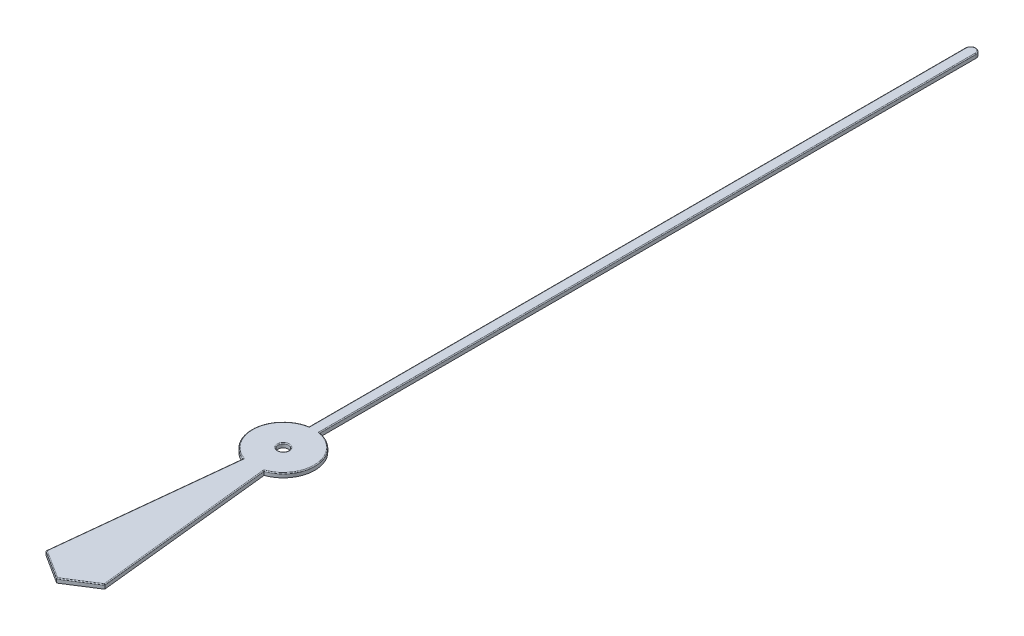
ISO-10303-21;
HEADER;
FILE_DESCRIPTION(('STEP AP214'),'2;1');
FILE_NAME('part.step','',(''),(''),'','','');
FILE_SCHEMA(('AUTOMOTIVE_DESIGN { 1 0 10303 214 1 1 1 1 }'));
ENDSEC;
DATA;
#1=APPLICATION_CONTEXT('core data for automotive mechanical design processes');
#2=APPLICATION_PROTOCOL_DEFINITION('international standard','automotive_design',2000,#1);
#3=PRODUCT_CONTEXT('',#1,'mechanical');
#4=PRODUCT('Part','Part','',(#3));
#5=PRODUCT_RELATED_PRODUCT_CATEGORY('part','',(#4));
#6=PRODUCT_DEFINITION_FORMATION('','',#4);
#7=PRODUCT_DEFINITION_CONTEXT('part definition',#1,'design');
#8=PRODUCT_DEFINITION('design','',#6,#7);
#9=PRODUCT_DEFINITION_SHAPE('','',#8);
#10=(LENGTH_UNIT() NAMED_UNIT(*) SI_UNIT(.MILLI.,.METRE.));
#11=(NAMED_UNIT(*) PLANE_ANGLE_UNIT() SI_UNIT($,.RADIAN.));
#12=(NAMED_UNIT(*) SI_UNIT($,.STERADIAN.) SOLID_ANGLE_UNIT());
#13=UNCERTAINTY_MEASURE_WITH_UNIT(LENGTH_MEASURE(1.E-05),#10,'distance_accuracy_value','');
#14=(GEOMETRIC_REPRESENTATION_CONTEXT(3) GLOBAL_UNCERTAINTY_ASSIGNED_CONTEXT((#13)) GLOBAL_UNIT_ASSIGNED_CONTEXT((#10,
#11,#12)) REPRESENTATION_CONTEXT('',''));
#15=CARTESIAN_POINT('',(0.,0.,0.));
#16=DIRECTION('',(0.,0.,1.));
#17=DIRECTION('',(1.,0.,0.));
#18=AXIS2_PLACEMENT_3D('',#15,#16,#17);
#19=CARTESIAN_POINT('',(0.,0.1,0.));
#20=DIRECTION('',(0.,1.,0.));
#21=DIRECTION('',(0.,0.,1.));
#22=AXIS2_PLACEMENT_3D('',#19,#20,#21);
#23=PLANE('',#22);
#24=CARTESIAN_POINT('',(0.,0.1,0.));
#25=DIRECTION('',(0.,1.,0.));
#26=DIRECTION('',(0.,0.,1.));
#27=AXIS2_PLACEMENT_3D('',#24,#25,#26);
#28=CIRCLE('',#27,0.145);
#29=CARTESIAN_POINT('',(0.,0.1,0.145));
#30=VERTEX_POINT('',#29);
#31=EDGE_CURVE('E233',#30,#30,#28,.F.);
#32=ORIENTED_EDGE('',*,*,#31,.T.);
#33=EDGE_LOOP('',(#32));
#34=FACE_BOUND('',#33,.T.);
#35=CARTESIAN_POINT('',(0.,0.1,0.));
#36=DIRECTION('',(0.,1.,0.));
#37=DIRECTION('',(0.,0.,1.));
#38=AXIS2_PLACEMENT_3D('',#35,#36,#37);
#39=CIRCLE('',#38,0.73);
#40=CARTESIAN_POINT('',(0.228429309852145,0.1,0.693339779906268));
#41=VERTEX_POINT('',#40);
#42=CARTESIAN_POINT('',(0.105,0.1,-0.722409163839994));
#43=VERTEX_POINT('',#42);
#44=EDGE_CURVE('E228',#41,#43,#39,.T.);
#45=ORIENTED_EDGE('',*,*,#44,.T.);
#46=DIRECTION('',(0.,0.,-1.));
#47=VECTOR('',#46,1.);
#48=CARTESIAN_POINT('',(0.105,0.1,-16.375));
#49=LINE('',#48,#47);
#50=CARTESIAN_POINT('',(0.105,0.1,-16.375));
#51=VERTEX_POINT('',#50);
#52=EDGE_CURVE('E230',#43,#51,#49,.T.);
#53=ORIENTED_EDGE('',*,*,#52,.T.);
#54=CARTESIAN_POINT('',(0.,0.1,-16.375));
#55=DIRECTION('',(0.,1.,0.));
#56=DIRECTION('',(0.,0.,1.));
#57=AXIS2_PLACEMENT_3D('',#54,#55,#56);
#58=CIRCLE('',#57,0.105);
#59=CARTESIAN_POINT('',(0.,0.1,-16.48));
#60=VERTEX_POINT('',#59);
#61=EDGE_CURVE('E212',#51,#60,#58,.T.);
#62=ORIENTED_EDGE('',*,*,#61,.T.);
#63=CARTESIAN_POINT('',(0.,0.1,-16.375));
#64=DIRECTION('',(0.,1.,0.));
#65=DIRECTION('',(0.,0.,1.));
#66=AXIS2_PLACEMENT_3D('',#63,#64,#65);
#67=CIRCLE('',#66,0.105);
#68=CARTESIAN_POINT('',(-0.105,0.1,-16.375));
#69=VERTEX_POINT('',#68);
#70=EDGE_CURVE('E214',#60,#69,#67,.T.);
#71=ORIENTED_EDGE('',*,*,#70,.T.);
#72=DIRECTION('',(0.,0.,1.));
#73=VECTOR('',#72,1.);
#74=CARTESIAN_POINT('',(-0.105,0.1,-0.739509972887452));
#75=LINE('',#74,#73);
#76=CARTESIAN_POINT('',(-0.105,0.1,-0.722409163839994));
#77=VERTEX_POINT('',#76);
#78=EDGE_CURVE('E216',#69,#77,#75,.T.);
#79=ORIENTED_EDGE('',*,*,#78,.T.);
#80=CARTESIAN_POINT('',(0.,0.1,0.));
#81=DIRECTION('',(0.,1.,0.));
#82=DIRECTION('',(0.,0.,1.));
#83=AXIS2_PLACEMENT_3D('',#80,#81,#82);
#84=CIRCLE('',#83,0.73);
#85=CARTESIAN_POINT('',(-0.228429309852145,0.1,0.693339779906268));
#86=VERTEX_POINT('',#85);
#87=EDGE_CURVE('E218',#77,#86,#84,.T.);
#88=ORIENTED_EDGE('',*,*,#87,.T.);
#89=DIRECTION('',(-0.105368695050218,0.,0.994433224557292));
#90=VECTOR('',#89,1.);
#91=CARTESIAN_POINT('',(-0.680111335508854,0.1,4.95615819133576));
#92=LINE('',#91,#90);
#93=CARTESIAN_POINT('',(-0.678806021477439,0.1,4.94383908991099));
#94=VERTEX_POINT('',#93);
#95=EDGE_CURVE('E220',#86,#94,#92,.T.);
#96=ORIENTED_EDGE('',*,*,#95,.T.);
#97=DIRECTION('',(0.843391445812887,0.,0.537299608346822));
#98=VECTOR('',#97,1.);
#99=CARTESIAN_POINT('',(0.0107459921669384,0.1,5.38313217108374));
#100=LINE('',#99,#98);
#101=CARTESIAN_POINT('',(0.,0.1,5.37628621905132));
#102=VERTEX_POINT('',#101);
#103=EDGE_CURVE('E222',#94,#102,#100,.T.);
#104=ORIENTED_EDGE('',*,*,#103,.T.);
#105=DIRECTION('',(0.843391445812887,0.,-0.537299608346822));
#106=VECTOR('',#105,1.);
#107=CARTESIAN_POINT('',(0.689254007833063,0.1,4.9371829885185));
#108=LINE('',#107,#106);
#109=CARTESIAN_POINT('',(0.67880602147744,0.1,4.94383908991099));
#110=VERTEX_POINT('',#109);
#111=EDGE_CURVE('E224',#102,#110,#108,.T.);
#112=ORIENTED_EDGE('',*,*,#111,.T.);
#113=DIRECTION('',(-0.105368695050219,0.,-0.994433224557292));
#114=VECTOR('',#113,1.);
#115=CARTESIAN_POINT('',(0.230111335508854,0.1,0.709214155087552));
#116=LINE('',#115,#114);
#117=EDGE_CURVE('E226',#110,#41,#116,.T.);
#118=ORIENTED_EDGE('',*,*,#117,.T.);
#119=EDGE_LOOP('',(#45,#53,#62,#71,#79,#88,#96,#104,#112,#118));
#120=FACE_BOUND('',#119,.T.);
#121=ADVANCED_FACE('F31',(#34,#120),#23,.T.);
#122=CARTESIAN_POINT('',(0.,0.,0.));
#123=DIRECTION('',(0.,1.,0.));
#124=DIRECTION('',(0.,0.,1.));
#125=AXIS2_PLACEMENT_3D('',#122,#123,#124);
#126=PLANE('',#125);
#127=DIRECTION('',(0.,0.,1.));
#128=VECTOR('',#127,1.);
#129=CARTESIAN_POINT('',(-0.125,0.,-0.739509972887452));
#130=LINE('',#129,#128);
#131=CARTESIAN_POINT('',(-0.125,0.,-16.375));
#132=VERTEX_POINT('',#131);
#133=CARTESIAN_POINT('',(-0.125,0.,-0.739509972887452));
#134=VERTEX_POINT('',#133);
#135=EDGE_CURVE('E178',#132,#134,#130,.T.);
#136=ORIENTED_EDGE('',*,*,#135,.F.);
#137=CARTESIAN_POINT('',(0.,0.,-16.375));
#138=DIRECTION('',(0.,1.,0.));
#139=DIRECTION('',(0.,0.,1.));
#140=AXIS2_PLACEMENT_3D('',#137,#138,#139);
#141=CIRCLE('',#140,0.125);
#142=CARTESIAN_POINT('',(0.,0.,-16.5));
#143=VERTEX_POINT('',#142);
#144=EDGE_CURVE('E202',#132,#143,#141,.F.);
#145=ORIENTED_EDGE('',*,*,#144,.T.);
#146=CARTESIAN_POINT('',(0.,0.,-16.375));
#147=DIRECTION('',(0.,1.,0.));
#148=DIRECTION('',(0.,0.,1.));
#149=AXIS2_PLACEMENT_3D('',#146,#147,#148);
#150=CIRCLE('',#149,0.125);
#151=CARTESIAN_POINT('',(0.125,0.,-16.375));
#152=VERTEX_POINT('',#151);
#153=EDGE_CURVE('E200',#143,#152,#150,.F.);
#154=ORIENTED_EDGE('',*,*,#153,.T.);
#155=DIRECTION('',(0.,0.,-1.));
#156=VECTOR('',#155,1.);
#157=CARTESIAN_POINT('',(0.125,0.,-0.739509972887452));
#158=LINE('',#157,#156);
#159=CARTESIAN_POINT('',(0.125,0.,-0.739509972887452));
#160=VERTEX_POINT('',#159);
#161=EDGE_CURVE('E175',#160,#152,#158,.T.);
#162=ORIENTED_EDGE('',*,*,#161,.F.);
#163=CARTESIAN_POINT('',(0.,0.,0.));
#164=DIRECTION('',(0.,1.,0.));
#165=DIRECTION('',(0.,0.,1.));
#166=AXIS2_PLACEMENT_3D('',#163,#164,#165);
#167=CIRCLE('',#166,0.75);
#168=CARTESIAN_POINT('',(0.25,0.,0.707106781186547));
#169=VERTEX_POINT('',#168);
#170=EDGE_CURVE('E162',#169,#160,#167,.T.);
#171=ORIENTED_EDGE('',*,*,#170,.F.);
#172=DIRECTION('',(-0.105368695050219,0.,-0.994433224557292));
#173=VECTOR('',#172,1.);
#174=CARTESIAN_POINT('',(0.25,0.,0.707106781186547));
#175=LINE('',#174,#173);
#176=CARTESIAN_POINT('',(0.700000000000001,0.,4.95405081743476));
#177=VERTEX_POINT('',#176);
#178=EDGE_CURVE('E143',#177,#169,#175,.T.);
#179=ORIENTED_EDGE('',*,*,#178,.F.);
#180=DIRECTION('',(0.843391445812887,0.,-0.537299608346822));
#181=VECTOR('',#180,1.);
#182=CARTESIAN_POINT('',(0.700000000000001,0.,4.95405081743476));
#183=LINE('',#182,#181);
#184=CARTESIAN_POINT('',(0.,0.,5.4));
#185=VERTEX_POINT('',#184);
#186=EDGE_CURVE('E159',#185,#177,#183,.T.);
#187=ORIENTED_EDGE('',*,*,#186,.F.);
#188=DIRECTION('',(0.843391445812887,0.,0.537299608346822));
#189=VECTOR('',#188,1.);
#190=CARTESIAN_POINT('',(-0.699999999999999,0.,4.95405081743476));
#191=LINE('',#190,#189);
#192=CARTESIAN_POINT('',(-0.699999999999999,0.,4.95405081743476));
#193=VERTEX_POINT('',#192);
#194=EDGE_CURVE('E187',#193,#185,#191,.T.);
#195=ORIENTED_EDGE('',*,*,#194,.F.);
#196=DIRECTION('',(-0.105368695050218,0.,0.994433224557292));
#197=VECTOR('',#196,1.);
#198=CARTESIAN_POINT('',(-0.25,0.,0.707106781186547));
#199=LINE('',#198,#197);
#200=CARTESIAN_POINT('',(-0.25,0.,0.707106781186547));
#201=VERTEX_POINT('',#200);
#202=EDGE_CURVE('E184',#201,#193,#199,.T.);
#203=ORIENTED_EDGE('',*,*,#202,.F.);
#204=CARTESIAN_POINT('',(0.,0.,0.));
#205=DIRECTION('',(0.,1.,0.));
#206=DIRECTION('',(0.,0.,1.));
#207=AXIS2_PLACEMENT_3D('',#204,#205,#206);
#208=CIRCLE('',#207,0.75);
#209=EDGE_CURVE('E181',#134,#201,#208,.T.);
#210=ORIENTED_EDGE('',*,*,#209,.F.);
#211=EDGE_LOOP('',(#136,#145,#154,#162,#171,#179,#187,#195,#203,#210));
#212=FACE_BOUND('',#211,.T.);
#213=CARTESIAN_POINT('',(0.,0.,0.));
#214=DIRECTION('',(0.,1.,0.));
#215=DIRECTION('',(0.,0.,1.));
#216=AXIS2_PLACEMENT_3D('',#213,#214,#215);
#217=CIRCLE('',#216,0.125);
#218=CARTESIAN_POINT('',(0.,0.,0.125));
#219=VERTEX_POINT('',#218);
#220=EDGE_CURVE('E168',#219,#219,#217,.T.);
#221=ORIENTED_EDGE('',*,*,#220,.T.);
#222=EDGE_LOOP('',(#221));
#223=FACE_BOUND('',#222,.T.);
#224=ADVANCED_FACE('F156',(#212,#223),#126,.F.);
#225=CARTESIAN_POINT('',(0.700000000000001,0.1,4.95405081743476));
#226=DIRECTION('',(-0.537299608346822,0.,-0.843391445812887));
#227=DIRECTION('',(-0.843391445812887,0.,0.537299608346822));
#228=AXIS2_PLACEMENT_3D('',#225,#226,#227);
#229=PLANE('',#228);
#230=DIRECTION('',(0.,-1.,0.));
#231=VECTOR('',#230,1.);
#232=CARTESIAN_POINT('',(0.700000000000001,0.1,4.95405081743476));
#233=LINE('',#232,#231);
#234=CARTESIAN_POINT('',(0.700000000000001,0.08,4.95405081743476));
#235=VERTEX_POINT('',#234);
#236=EDGE_CURVE('E139',#235,#177,#233,.T.);
#237=ORIENTED_EDGE('',*,*,#236,.F.);
#238=DIRECTION('',(0.843391445812887,0.,-0.537299608346822));
#239=VECTOR('',#238,1.);
#240=CARTESIAN_POINT('',(0.,0.08,5.4));
#241=LINE('',#240,#239);
#242=CARTESIAN_POINT('',(0.,0.08,5.4));
#243=VERTEX_POINT('',#242);
#244=EDGE_CURVE('E242',#235,#243,#241,.F.);
#245=ORIENTED_EDGE('',*,*,#244,.T.);
#246=DIRECTION('',(0.,-1.,0.));
#247=VECTOR('',#246,1.);
#248=CARTESIAN_POINT('',(0.,0.1,5.4));
#249=LINE('',#248,#247);
#250=EDGE_CURVE('E166',#243,#185,#249,.T.);
#251=ORIENTED_EDGE('',*,*,#250,.T.);
#252=ORIENTED_EDGE('',*,*,#186,.T.);
#253=EDGE_LOOP('',(#237,#245,#251,#252));
#254=FACE_BOUND('',#253,.T.);
#255=ADVANCED_FACE('F164',(#254),#229,.F.);
#256=CARTESIAN_POINT('',(0.25,0.1,0.707106781186547));
#257=DIRECTION('',(-0.994433224557292,0.,0.105368695050219));
#258=DIRECTION('',(0.105368695050219,0.,0.994433224557292));
#259=AXIS2_PLACEMENT_3D('',#256,#257,#258);
#260=PLANE('',#259);
#261=DIRECTION('',(0.,-1.,0.));
#262=VECTOR('',#261,1.);
#263=CARTESIAN_POINT('',(0.25,0.1,0.707106781186547));
#264=LINE('',#263,#262);
#265=CARTESIAN_POINT('',(0.25,0.08,0.707106781186547));
#266=VERTEX_POINT('',#265);
#267=EDGE_CURVE('E151',#266,#169,#264,.T.);
#268=ORIENTED_EDGE('',*,*,#267,.F.);
#269=DIRECTION('',(-0.105368695050219,0.,-0.994433224557292));
#270=VECTOR('',#269,1.);
#271=CARTESIAN_POINT('',(0.700000000000001,0.08,4.95405081743476));
#272=LINE('',#271,#270);
#273=EDGE_CURVE('E146',#266,#235,#272,.F.);
#274=ORIENTED_EDGE('',*,*,#273,.T.);
#275=ORIENTED_EDGE('',*,*,#236,.T.);
#276=ORIENTED_EDGE('',*,*,#178,.T.);
#277=EDGE_LOOP('',(#268,#274,#275,#276));
#278=FACE_BOUND('',#277,.T.);
#279=ADVANCED_FACE('F142',(#278),#260,.F.);
#280=CARTESIAN_POINT('',(0.,0.1,0.));
#281=DIRECTION('',(0.,-1.,0.));
#282=DIRECTION('',(0.,0.,-1.));
#283=AXIS2_PLACEMENT_3D('',#280,#281,#282);
#284=CYLINDRICAL_SURFACE('',#283,0.75);
#285=DIRECTION('',(0.,-1.,0.));
#286=VECTOR('',#285,1.);
#287=CARTESIAN_POINT('',(0.125,0.1,-0.739509972887452));
#288=LINE('',#287,#286);
#289=CARTESIAN_POINT('',(0.125,0.08,-0.739509972887452));
#290=VERTEX_POINT('',#289);
#291=EDGE_CURVE('E196',#290,#160,#288,.T.);
#292=ORIENTED_EDGE('',*,*,#291,.F.);
#293=CARTESIAN_POINT('',(0.,0.08,0.));
#294=DIRECTION('',(0.,1.,0.));
#295=DIRECTION('',(0.,0.,1.));
#296=AXIS2_PLACEMENT_3D('',#293,#294,#295);
#297=CIRCLE('',#296,0.75);
#298=EDGE_CURVE('E239',#290,#266,#297,.F.);
#299=ORIENTED_EDGE('',*,*,#298,.T.);
#300=ORIENTED_EDGE('',*,*,#267,.T.);
#301=ORIENTED_EDGE('',*,*,#170,.T.);
#302=EDGE_LOOP('',(#292,#299,#300,#301));
#303=FACE_BOUND('',#302,.T.);
#304=ADVANCED_FACE('F354',(#303),#284,.T.);
#305=CARTESIAN_POINT('',(0.125,0.1,-0.739509972887452));
#306=DIRECTION('',(-1.,0.,0.));
#307=DIRECTION('',(0.,0.,1.));
#308=AXIS2_PLACEMENT_3D('',#305,#306,#307);
#309=PLANE('',#308);
#310=DIRECTION('',(0.,-1.,0.));
#311=VECTOR('',#310,1.);
#312=CARTESIAN_POINT('',(0.125,0.1,-16.375));
#313=LINE('',#312,#311);
#314=CARTESIAN_POINT('',(0.125,0.08,-16.375));
#315=VERTEX_POINT('',#314);
#316=EDGE_CURVE('E205',#152,#315,#313,.F.);
#317=ORIENTED_EDGE('',*,*,#316,.T.);
#318=DIRECTION('',(0.,0.,-1.));
#319=VECTOR('',#318,1.);
#320=CARTESIAN_POINT('',(0.125,0.08,-0.739509972887452));
#321=LINE('',#320,#319);
#322=EDGE_CURVE('E236',#315,#290,#321,.F.);
#323=ORIENTED_EDGE('',*,*,#322,.T.);
#324=ORIENTED_EDGE('',*,*,#291,.T.);
#325=ORIENTED_EDGE('',*,*,#161,.T.);
#326=EDGE_LOOP('',(#317,#323,#324,#325));
#327=FACE_BOUND('',#326,.T.);
#328=ADVANCED_FACE('F351',(#327),#309,.F.);
#329=CARTESIAN_POINT('',(-0.125,0.1,-0.739509972887452));
#330=DIRECTION('',(1.,0.,0.));
#331=DIRECTION('',(0.,0.,-1.));
#332=AXIS2_PLACEMENT_3D('',#329,#330,#331);
#333=PLANE('',#332);
#334=DIRECTION('',(0.,-1.,0.));
#335=VECTOR('',#334,1.);
#336=CARTESIAN_POINT('',(-0.125,0.1,-0.739509972887452));
#337=LINE('',#336,#335);
#338=CARTESIAN_POINT('',(-0.125,0.08,-0.739509972887452));
#339=VERTEX_POINT('',#338);
#340=EDGE_CURVE('E194',#339,#134,#337,.T.);
#341=ORIENTED_EDGE('',*,*,#340,.F.);
#342=DIRECTION('',(0.,0.,1.));
#343=VECTOR('',#342,1.);
#344=CARTESIAN_POINT('',(-0.125,0.08,-16.375));
#345=LINE('',#344,#343);
#346=CARTESIAN_POINT('',(-0.125,0.08,-16.375));
#347=VERTEX_POINT('',#346);
#348=EDGE_CURVE('E55',#339,#347,#345,.F.);
#349=ORIENTED_EDGE('',*,*,#348,.T.);
#350=DIRECTION('',(0.,-1.,0.));
#351=VECTOR('',#350,1.);
#352=CARTESIAN_POINT('',(-0.125,0.1,-16.375));
#353=LINE('',#352,#351);
#354=EDGE_CURVE('E150',#347,#132,#353,.T.);
#355=ORIENTED_EDGE('',*,*,#354,.T.);
#356=ORIENTED_EDGE('',*,*,#135,.T.);
#357=EDGE_LOOP('',(#341,#349,#355,#356));
#358=FACE_BOUND('',#357,.T.);
#359=ADVANCED_FACE('F347',(#358),#333,.F.);
#360=CARTESIAN_POINT('',(0.,0.1,0.));
#361=DIRECTION('',(0.,-1.,0.));
#362=DIRECTION('',(0.,0.,-1.));
#363=AXIS2_PLACEMENT_3D('',#360,#361,#362);
#364=CYLINDRICAL_SURFACE('',#363,0.75);
#365=DIRECTION('',(0.,-1.,0.));
#366=VECTOR('',#365,1.);
#367=CARTESIAN_POINT('',(-0.25,0.1,0.707106781186547));
#368=LINE('',#367,#366);
#369=CARTESIAN_POINT('',(-0.25,0.08,0.707106781186547));
#370=VERTEX_POINT('',#369);
#371=EDGE_CURVE('E192',#370,#201,#368,.T.);
#372=ORIENTED_EDGE('',*,*,#371,.F.);
#373=CARTESIAN_POINT('',(0.,0.08,0.));
#374=DIRECTION('',(0.,1.,0.));
#375=DIRECTION('',(0.,0.,1.));
#376=AXIS2_PLACEMENT_3D('',#373,#374,#375);
#377=CIRCLE('',#376,0.75);
#378=EDGE_CURVE('E248',#370,#339,#377,.F.);
#379=ORIENTED_EDGE('',*,*,#378,.T.);
#380=ORIENTED_EDGE('',*,*,#340,.T.);
#381=ORIENTED_EDGE('',*,*,#209,.T.);
#382=EDGE_LOOP('',(#372,#379,#380,#381));
#383=FACE_BOUND('',#382,.T.);
#384=ADVANCED_FACE('F343',(#383),#364,.T.);
#385=CARTESIAN_POINT('',(-0.25,0.1,0.707106781186547));
#386=DIRECTION('',(0.994433224557292,0.,0.105368695050218));
#387=DIRECTION('',(0.105368695050218,0.,-0.994433224557292));
#388=AXIS2_PLACEMENT_3D('',#385,#386,#387);
#389=PLANE('',#388);
#390=DIRECTION('',(0.,-1.,0.));
#391=VECTOR('',#390,1.);
#392=CARTESIAN_POINT('',(-0.699999999999999,0.1,4.95405081743476));
#393=LINE('',#392,#391);
#394=CARTESIAN_POINT('',(-0.699999999999999,0.08,4.95405081743476));
#395=VERTEX_POINT('',#394);
#396=EDGE_CURVE('E190',#395,#193,#393,.T.);
#397=ORIENTED_EDGE('',*,*,#396,.F.);
#398=DIRECTION('',(-0.105368695050218,0.,0.994433224557292));
#399=VECTOR('',#398,1.);
#400=CARTESIAN_POINT('',(-0.25,0.08,0.707106781186548));
#401=LINE('',#400,#399);
#402=EDGE_CURVE('E246',#395,#370,#401,.F.);
#403=ORIENTED_EDGE('',*,*,#402,.T.);
#404=ORIENTED_EDGE('',*,*,#371,.T.);
#405=ORIENTED_EDGE('',*,*,#202,.T.);
#406=EDGE_LOOP('',(#397,#403,#404,#405));
#407=FACE_BOUND('',#406,.T.);
#408=ADVANCED_FACE('F339',(#407),#389,.F.);
#409=CARTESIAN_POINT('',(-0.699999999999999,0.1,4.95405081743476));
#410=DIRECTION('',(0.537299608346822,0.,-0.843391445812887));
#411=DIRECTION('',(-0.843391445812887,0.,-0.537299608346822));
#412=AXIS2_PLACEMENT_3D('',#409,#410,#411);
#413=PLANE('',#412);
#414=ORIENTED_EDGE('',*,*,#250,.F.);
#415=DIRECTION('',(0.843391445812887,0.,0.537299608346822));
#416=VECTOR('',#415,1.);
#417=CARTESIAN_POINT('',(-0.699999999999999,0.08,4.95405081743476));
#418=LINE('',#417,#416);
#419=EDGE_CURVE('E244',#243,#395,#418,.F.);
#420=ORIENTED_EDGE('',*,*,#419,.T.);
#421=ORIENTED_EDGE('',*,*,#396,.T.);
#422=ORIENTED_EDGE('',*,*,#194,.T.);
#423=EDGE_LOOP('',(#414,#420,#421,#422));
#424=FACE_BOUND('',#423,.T.);
#425=ADVANCED_FACE('F336',(#424),#413,.F.);
#426=CARTESIAN_POINT('',(0.,0.1,0.));
#427=DIRECTION('',(0.,-1.,0.));
#428=DIRECTION('',(0.,0.,-1.));
#429=AXIS2_PLACEMENT_3D('',#426,#427,#428);
#430=CYLINDRICAL_SURFACE('',#429,0.125);
#431=CARTESIAN_POINT('',(0.,0.08,0.));
#432=DIRECTION('',(0.,1.,0.));
#433=DIRECTION('',(0.,0.,1.));
#434=AXIS2_PLACEMENT_3D('',#431,#432,#433);
#435=CIRCLE('',#434,0.125);
#436=CARTESIAN_POINT('',(0.,0.08,0.125));
#437=VERTEX_POINT('',#436);
#438=EDGE_CURVE('E208',#437,#437,#435,.T.);
#439=ORIENTED_EDGE('',*,*,#438,.T.);
#440=EDGE_LOOP('',(#439));
#441=FACE_BOUND('',#440,.T.);
#442=ORIENTED_EDGE('',*,*,#220,.F.);
#443=EDGE_LOOP('',(#442));
#444=FACE_BOUND('',#443,.T.);
#445=ADVANCED_FACE('F334',(#441,#444),#430,.F.);
#446=CARTESIAN_POINT('',(0.,0.1,-16.375));
#447=DIRECTION('',(0.,-1.,0.));
#448=DIRECTION('',(0.,0.,-1.));
#449=AXIS2_PLACEMENT_3D('',#446,#447,#448);
#450=CYLINDRICAL_SURFACE('',#449,0.125);
#451=DIRECTION('',(0.,-1.,0.));
#452=VECTOR('',#451,1.);
#453=CARTESIAN_POINT('',(0.,0.1,-16.5));
#454=LINE('',#453,#452);
#455=CARTESIAN_POINT('',(0.,0.08,-16.5));
#456=VERTEX_POINT('',#455);
#457=EDGE_CURVE('E171',#456,#143,#454,.T.);
#458=ORIENTED_EDGE('',*,*,#457,.F.);
#459=CARTESIAN_POINT('',(0.,0.08,-16.375));
#460=DIRECTION('',(0.,1.,0.));
#461=DIRECTION('',(0.,0.,1.));
#462=AXIS2_PLACEMENT_3D('',#459,#460,#461);
#463=CIRCLE('',#462,0.125);
#464=EDGE_CURVE('E11',#456,#315,#463,.F.);
#465=ORIENTED_EDGE('',*,*,#464,.T.);
#466=ORIENTED_EDGE('',*,*,#316,.F.);
#467=ORIENTED_EDGE('',*,*,#153,.F.);
#468=EDGE_LOOP('',(#458,#465,#466,#467));
#469=FACE_BOUND('',#468,.T.);
#470=ADVANCED_FACE('F366',(#469),#450,.T.);
#471=CARTESIAN_POINT('',(0.,0.1,-16.375));
#472=DIRECTION('',(0.,-1.,0.));
#473=DIRECTION('',(0.,0.,-1.));
#474=AXIS2_PLACEMENT_3D('',#471,#472,#473);
#475=CYLINDRICAL_SURFACE('',#474,0.125);
#476=ORIENTED_EDGE('',*,*,#354,.F.);
#477=CARTESIAN_POINT('',(0.,0.08,-16.375));
#478=DIRECTION('',(0.,1.,0.));
#479=DIRECTION('',(0.,0.,1.));
#480=AXIS2_PLACEMENT_3D('',#477,#478,#479);
#481=CIRCLE('',#480,0.125);
#482=EDGE_CURVE('E40',#347,#456,#481,.F.);
#483=ORIENTED_EDGE('',*,*,#482,.T.);
#484=ORIENTED_EDGE('',*,*,#457,.T.);
#485=ORIENTED_EDGE('',*,*,#144,.F.);
#486=EDGE_LOOP('',(#476,#483,#484,#485));
#487=FACE_BOUND('',#486,.T.);
#488=ADVANCED_FACE('F363',(#487),#475,.T.);
#489=CARTESIAN_POINT('',(0.,0.08,0.));
#490=DIRECTION('',(0.,1.,0.));
#491=DIRECTION('',(0.,0.,1.));
#492=AXIS2_PLACEMENT_3D('',#489,#490,#491);
#493=TOROIDAL_SURFACE('',#492,0.145,0.02);
#494=ORIENTED_EDGE('',*,*,#31,.F.);
#495=EDGE_LOOP('',(#494));
#496=FACE_BOUND('',#495,.T.);
#497=ORIENTED_EDGE('',*,*,#438,.F.);
#498=EDGE_LOOP('',(#497));
#499=FACE_BOUND('',#498,.T.);
#500=ADVANCED_FACE('F316',(#496,#499),#493,.T.);
#501=CARTESIAN_POINT('',(-0.153243539525779,0.08,-0.016237462089922));
#502=DIRECTION('',(0.105368695050218,0.,-0.994433224557292));
#503=DIRECTION('',(-0.994433224557292,0.,-0.105368695050218));
#504=AXIS2_PLACEMENT_3D('',#501,#502,#503);
#505=CYLINDRICAL_SURFACE('',#504,0.02);
#506=CARTESIAN_POINT('',(-0.25,0.08,0.707106781186547));
#507=CARTESIAN_POINT('',(-0.250001559785452,0.0809545315697147,0.707107745159193));
#508=CARTESIAN_POINT('',(-0.249926474173901,0.0819073953312107,0.707060407769698));
#509=CARTESIAN_POINT('',(-0.249636071466557,0.0837768755195683,0.706877213546408));
#510=CARTESIAN_POINT('',(-0.249421632871455,0.0846936811194405,0.706741911253328));
#511=CARTESIAN_POINT('',(-0.248865768360552,0.0864692138917709,0.706390990938327));
#512=CARTESIAN_POINT('',(-0.248524558950919,0.087328037151428,0.706175509849226));
#513=CARTESIAN_POINT('',(-0.247733411354541,0.0889730136458272,0.705675509800244));
#514=CARTESIAN_POINT('',(-0.247283331067529,0.089759070034535,0.705390900611085));
#515=CARTESIAN_POINT('',(-0.246257260885552,0.0913017187722919,0.704741483642587));
#516=CARTESIAN_POINT('',(-0.245674448735701,0.0920519006309949,0.704372319217448));
#517=CARTESIAN_POINT('',(-0.244427608271138,0.0934496650223998,0.703581679478155));
#518=CARTESIAN_POINT('',(-0.243763535673604,0.0940971911677855,0.703160175639812));
#519=CARTESIAN_POINT('',(-0.242039629706874,0.0955737254538674,0.702064643871728));
#520=CARTESIAN_POINT('',(-0.240942444153845,0.0963413652543254,0.70136627388133));
#521=CARTESIAN_POINT('',(-0.23865818592118,0.097654837350688,0.699909430966898));
#522=CARTESIAN_POINT('',(-0.237470954510726,0.098200266628297,0.699150851792696));
#523=CARTESIAN_POINT('',(-0.235109835011881,0.099052101437625,0.697639079697763));
#524=CARTESIAN_POINT('',(-0.233938735419772,0.0993698971787456,0.696887839291707));
#525=CARTESIAN_POINT('',(-0.23157496901816,0.0998179964583637,0.695368467774961));
#526=CARTESIAN_POINT('',(-0.23038235053463,0.0999486773043655,0.694600373834944));
#527=CARTESIAN_POINT('',(-0.228935983019672,0.0999958689081103,0.693666969474259));
#528=CARTESIAN_POINT('',(-0.22868259977147,0.0999999970925754,0.693503380018059));
#529=CARTESIAN_POINT('',(-0.228429309852145,0.1,0.693339779906268));
#530=B_SPLINE_CURVE_WITH_KNOTS('',3,(#506,#507,#508,#509,#510,#511,#512,#513,#514,#515,#516,
#517,#518,#519,#520,#521,#522,#523,#524,#525,#526,#527,#528,#529),.UNSPECIFIED.,.F.,.F.,(4,2,2,
2,2,2,2,2,2,2,2,4),(0.,0.00285684050464972,0.00569584354680671,0.0085300201060718,
0.0113679160367199,0.0144143662064755,0.0174624839929143,0.0219687673700531,0.0264831876940209,
0.0307519873918048,0.0350121670946863,0.0359169308569),.UNSPECIFIED.);
#531=EDGE_CURVE('E307',#370,#86,#530,.T.);
#532=ORIENTED_EDGE('',*,*,#531,.F.);
#533=ORIENTED_EDGE('',*,*,#402,.F.);
#534=CARTESIAN_POINT('',(-0.678806021477439,0.08,4.94383908991099));
#535=DIRECTION('',(-0.434064719746076,0.,-0.900881689830446));
#536=DIRECTION('',(0.900881689830446,0.,-0.434064719746076));
#537=AXIS2_PLACEMENT_3D('',#534,#535,#536);
#538=ELLIPSE('',#537,0.0235258178313618,0.02);
#539=EDGE_CURVE('E35',#94,#395,#538,.F.);
#540=ORIENTED_EDGE('',*,*,#539,.F.);
#541=ORIENTED_EDGE('',*,*,#95,.F.);
#542=EDGE_LOOP('',(#532,#533,#540,#541));
#543=FACE_BOUND('',#542,.T.);
#544=ADVANCED_FACE('F313',(#543),#505,.T.);
#545=CARTESIAN_POINT('',(-2.43628503283201,0.08,3.82420147778364));
#546=DIRECTION('',(-0.843391445812887,0.,-0.537299608346822));
#547=DIRECTION('',(-0.537299608346822,0.,0.843391445812887));
#548=AXIS2_PLACEMENT_3D('',#545,#546,#547);
#549=CYLINDRICAL_SURFACE('',#548,0.02);
#550=ORIENTED_EDGE('',*,*,#539,.T.);
#551=ORIENTED_EDGE('',*,*,#419,.F.);
#552=CARTESIAN_POINT('',(0.,0.08,5.37628621905132));
#553=DIRECTION('',(-1.,0.,0.));
#554=DIRECTION('',(0.,0.,-1.));
#555=AXIS2_PLACEMENT_3D('',#552,#553,#554);
#556=ELLIPSE('',#555,0.0237137809486832,0.02);
#557=EDGE_CURVE('E312',#102,#243,#556,.F.);
#558=ORIENTED_EDGE('',*,*,#557,.F.);
#559=ORIENTED_EDGE('',*,*,#103,.F.);
#560=EDGE_LOOP('',(#550,#551,#558,#559));
#561=FACE_BOUND('',#560,.T.);
#562=ADVANCED_FACE('F33',(#561),#549,.T.);
#563=CARTESIAN_POINT('',(0.,0.08,0.));
#564=DIRECTION('',(0.,1.,0.));
#565=DIRECTION('',(0.,0.,1.));
#566=AXIS2_PLACEMENT_3D('',#563,#564,#565);
#567=TOROIDAL_SURFACE('',#566,0.73,0.02);
#568=ORIENTED_EDGE('',*,*,#531,.T.);
#569=ORIENTED_EDGE('',*,*,#87,.F.);
#570=CARTESIAN_POINT('',(-0.125,0.08,-0.739509972887452));
#571=CARTESIAN_POINT('',(-0.125001467046501,0.0809386935388537,-0.739511190451546));
#572=CARTESIAN_POINT('',(-0.124934018007179,0.081875562171639,-0.739454208345902));
#573=CARTESIAN_POINT('',(-0.124673748173242,0.0837123831307887,-0.739234202179906));
#574=CARTESIAN_POINT('',(-0.124481816368342,0.0846125494837176,-0.739071930041578));
#575=CARTESIAN_POINT('',(-0.123985219413414,0.0863549999242453,-0.73865185655644));
#576=CARTESIAN_POINT('',(-0.123680776285456,0.087197394159799,-0.738394243347685));
#577=CARTESIAN_POINT('',(-0.122976104277849,0.0888111382949838,-0.73779754684407));
#578=CARTESIAN_POINT('',(-0.122575705918619,0.0895823591092337,-0.737458319395001));
#579=CARTESIAN_POINT('',(-0.121551537975128,0.0912841235328889,-0.73658989007954));
#580=CARTESIAN_POINT('',(-0.120897642925278,0.0921833978983157,-0.736034924971137));
#581=CARTESIAN_POINT('',(-0.119487877916203,0.0938304471946423,-0.734836858058206));
#582=CARTESIAN_POINT('',(-0.118731835506696,0.094577960454815,-0.734193607175461));
#583=CARTESIAN_POINT('',(-0.116913352062219,0.0961208681995625,-0.732644150400519));
#584=CARTESIAN_POINT('',(-0.115826289617779,0.0968654153211034,-0.731716327982284));
#585=CARTESIAN_POINT('',(-0.113577620449027,0.0981129819613864,-0.729793088743231));
#586=CARTESIAN_POINT('',(-0.112415972206558,0.098615865613505,-0.728797634256802));
#587=CARTESIAN_POINT('',(-0.110323945974157,0.0993021543674775,-0.727001063462741));
#588=CARTESIAN_POINT('',(-0.109401682204026,0.0995323946793685,-0.726207782979883));
#589=CARTESIAN_POINT('',(-0.107546315403261,0.0998595503491938,-0.724609226165303));
#590=CARTESIAN_POINT('',(-0.106613233650121,0.099956693451045,-0.72380397271401));
#591=CARTESIAN_POINT('',(-0.10545335901127,0.0999961457015176,-0.722801312912644));
#592=CARTESIAN_POINT('',(-0.105226637890919,0.0999999967342693,-0.722605242708566));
#593=CARTESIAN_POINT('',(-0.105,0.1,-0.722409163839994));
#594=B_SPLINE_CURVE_WITH_KNOTS('',3,(#570,#571,#572,#573,#574,#575,#576,#577,#578,#579,#580,
#581,#582,#583,#584,#585,#586,#587,#588,#589,#590,#591,#592,#593),.UNSPECIFIED.,.F.,.F.,(4,2,2,
2,2,2,2,2,2,2,2,4),(0.,0.00280904531907645,0.00559824758821281,0.00838197497450259,
0.0111706557947381,0.0148784823739738,0.0185926487879759,0.0234017380656705,0.0282135279274089,
0.0319209093995166,0.03562193917943,0.0365211276750697),.UNSPECIFIED.);
#595=EDGE_CURVE('E302',#339,#77,#594,.T.);
#596=ORIENTED_EDGE('',*,*,#595,.F.);
#597=ORIENTED_EDGE('',*,*,#378,.F.);
#598=EDGE_LOOP('',(#568,#569,#596,#597));
#599=FACE_BOUND('',#598,.T.);
#600=ADVANCED_FACE('F292',(#599),#567,.T.);
#601=CARTESIAN_POINT('',(2.43628503283201,0.08,3.82420147778364));
#602=DIRECTION('',(-0.843391445812887,0.,0.537299608346822));
#603=DIRECTION('',(0.537299608346822,0.,0.843391445812887));
#604=AXIS2_PLACEMENT_3D('',#601,#602,#603);
#605=CYLINDRICAL_SURFACE('',#604,0.02);
#606=ORIENTED_EDGE('',*,*,#557,.T.);
#607=ORIENTED_EDGE('',*,*,#244,.F.);
#608=CARTESIAN_POINT('',(0.67880602147744,0.08,4.94383908991099));
#609=DIRECTION('',(-0.434064719746076,0.,0.900881689830446));
#610=DIRECTION('',(-0.900881689830446,0.,-0.434064719746076));
#611=AXIS2_PLACEMENT_3D('',#608,#609,#610);
#612=ELLIPSE('',#611,0.0235258178313618,0.02);
#613=EDGE_CURVE('E483',#110,#235,#612,.F.);
#614=ORIENTED_EDGE('',*,*,#613,.F.);
#615=ORIENTED_EDGE('',*,*,#111,.F.);
#616=EDGE_LOOP('',(#606,#607,#614,#615));
#617=FACE_BOUND('',#616,.T.);
#618=ADVANCED_FACE('F296',(#617),#605,.T.);
#619=CARTESIAN_POINT('',(-0.105,0.08,0.));
#620=DIRECTION('',(0.,0.,-1.));
#621=DIRECTION('',(-1.,0.,0.));
#622=AXIS2_PLACEMENT_3D('',#619,#620,#621);
#623=CYLINDRICAL_SURFACE('',#622,0.02);
#624=ORIENTED_EDGE('',*,*,#595,.T.);
#625=ORIENTED_EDGE('',*,*,#78,.F.);
#626=CARTESIAN_POINT('',(-0.105,0.08,-16.375));
#627=DIRECTION('',(0.,0.,-1.));
#628=DIRECTION('',(-1.,0.,0.));
#629=AXIS2_PLACEMENT_3D('',#626,#627,#628);
#630=CIRCLE('',#629,0.02);
#631=EDGE_CURVE('E281',#347,#69,#630,.T.);
#632=ORIENTED_EDGE('',*,*,#631,.F.);
#633=ORIENTED_EDGE('',*,*,#348,.F.);
#634=EDGE_LOOP('',(#624,#625,#632,#633));
#635=FACE_BOUND('',#634,.T.);
#636=ADVANCED_FACE('F287',(#635),#623,.T.);
#637=CARTESIAN_POINT('',(0.153243539525779,0.08,-0.0162374620899221));
#638=DIRECTION('',(0.105368695050219,0.,0.994433224557292));
#639=DIRECTION('',(0.994433224557292,0.,-0.105368695050219));
#640=AXIS2_PLACEMENT_3D('',#637,#638,#639);
#641=CYLINDRICAL_SURFACE('',#640,0.02);
#642=ORIENTED_EDGE('',*,*,#613,.T.);
#643=ORIENTED_EDGE('',*,*,#273,.F.);
#644=CARTESIAN_POINT('',(0.25,0.08,0.707106781186547));
#645=CARTESIAN_POINT('',(0.250001559785452,0.0809545315697147,0.707107745159193));
#646=CARTESIAN_POINT('',(0.249926474173901,0.0819073953312107,0.707060407769698));
#647=CARTESIAN_POINT('',(0.249636071466557,0.0837768755195683,0.706877213546408));
#648=CARTESIAN_POINT('',(0.249421632871455,0.0846936811194405,0.706741911253328));
#649=CARTESIAN_POINT('',(0.248865768360552,0.0864692138917709,0.706390990938327));
#650=CARTESIAN_POINT('',(0.24852455895092,0.0873280371514281,0.706175509849226));
#651=CARTESIAN_POINT('',(0.247733411354541,0.0889730136458273,0.705675509800244));
#652=CARTESIAN_POINT('',(0.247283331067529,0.0897590700345351,0.705390900611085));
#653=CARTESIAN_POINT('',(0.246257260885552,0.091301718772292,0.704741483642587));
#654=CARTESIAN_POINT('',(0.245674448735701,0.0920519006309949,0.704372319217447));
#655=CARTESIAN_POINT('',(0.244427608271139,0.0934496650223999,0.703581679478155));
#656=CARTESIAN_POINT('',(0.243763535673604,0.0940971911677856,0.703160175639812));
#657=CARTESIAN_POINT('',(0.242039629706874,0.0955737254538675,0.702064643871728));
#658=CARTESIAN_POINT('',(0.240942444153845,0.0963413652543254,0.70136627388133));
#659=CARTESIAN_POINT('',(0.238658185921181,0.097654837350688,0.699909430966898));
#660=CARTESIAN_POINT('',(0.237470954510726,0.0982002666282971,0.699150851792696));
#661=CARTESIAN_POINT('',(0.235109835011881,0.0990521014376251,0.697639079697763));
#662=CARTESIAN_POINT('',(0.233938735419772,0.0993698971787456,0.696887839291707));
#663=CARTESIAN_POINT('',(0.23157496901816,0.0998179964583637,0.695368467774961));
#664=CARTESIAN_POINT('',(0.23038235053463,0.0999486773043655,0.694600373834944));
#665=CARTESIAN_POINT('',(0.228935983019672,0.0999958689081103,0.693666969474259));
#666=CARTESIAN_POINT('',(0.228682599771471,0.0999999970925754,0.693503380018059));
#667=CARTESIAN_POINT('',(0.228429309852145,0.1,0.693339779906268));
#668=B_SPLINE_CURVE_WITH_KNOTS('',3,(#644,#645,#646,#647,#648,#649,#650,#651,#652,#653,#654,
#655,#656,#657,#658,#659,#660,#661,#662,#663,#664,#665,#666,#667),.UNSPECIFIED.,.F.,.F.,(4,2,2,
2,2,2,2,2,2,2,2,4),(0.,0.00285684050464973,0.00569584354680674,0.0085300201060719,
0.01136791603672,0.0144143662064755,0.0174624839929143,0.0219687673700533,0.0264831876940212,
0.0307519873918048,0.0350121670946862,0.0359169308568998),.UNSPECIFIED.);
#669=EDGE_CURVE('E275',#41,#266,#668,.F.);
#670=ORIENTED_EDGE('',*,*,#669,.F.);
#671=ORIENTED_EDGE('',*,*,#117,.F.);
#672=EDGE_LOOP('',(#642,#643,#670,#671));
#673=FACE_BOUND('',#672,.T.);
#674=ADVANCED_FACE('F283',(#673),#641,.T.);
#675=CARTESIAN_POINT('',(0.,0.08,-16.375));
#676=DIRECTION('',(0.,1.,0.));
#677=DIRECTION('',(0.,0.,1.));
#678=AXIS2_PLACEMENT_3D('',#675,#676,#677);
#679=TOROIDAL_SURFACE('',#678,0.105,0.02);
#680=ORIENTED_EDGE('',*,*,#631,.T.);
#681=ORIENTED_EDGE('',*,*,#70,.F.);
#682=CARTESIAN_POINT('',(0.,0.08,-16.48));
#683=DIRECTION('',(1.,0.,0.));
#684=DIRECTION('',(0.,0.,-1.));
#685=AXIS2_PLACEMENT_3D('',#682,#683,#684);
#686=CIRCLE('',#685,0.02);
#687=EDGE_CURVE('E261',#456,#60,#686,.T.);
#688=ORIENTED_EDGE('',*,*,#687,.F.);
#689=ORIENTED_EDGE('',*,*,#482,.F.);
#690=EDGE_LOOP('',(#680,#681,#688,#689));
#691=FACE_BOUND('',#690,.T.);
#692=ADVANCED_FACE('F271',(#691),#679,.T.);
#693=CARTESIAN_POINT('',(0.,0.08,0.));
#694=DIRECTION('',(0.,1.,0.));
#695=DIRECTION('',(0.,0.,1.));
#696=AXIS2_PLACEMENT_3D('',#693,#694,#695);
#697=TOROIDAL_SURFACE('',#696,0.73,0.02);
#698=ORIENTED_EDGE('',*,*,#669,.T.);
#699=ORIENTED_EDGE('',*,*,#298,.F.);
#700=CARTESIAN_POINT('',(0.125,0.08,-0.739509972887452));
#701=CARTESIAN_POINT('',(0.125001467046501,0.0809386935388537,-0.739511190451546));
#702=CARTESIAN_POINT('',(0.124934018007179,0.0818755621716389,-0.739454208345902));
#703=CARTESIAN_POINT('',(0.124673748173242,0.0837123831307887,-0.739234202179906));
#704=CARTESIAN_POINT('',(0.124481816368342,0.0846125494837176,-0.739071930041578));
#705=CARTESIAN_POINT('',(0.123985219413414,0.0863549999242453,-0.73865185655644));
#706=CARTESIAN_POINT('',(0.123680776285456,0.087197394159799,-0.738394243347685));
#707=CARTESIAN_POINT('',(0.122976104277849,0.0888111382949837,-0.73779754684407));
#708=CARTESIAN_POINT('',(0.122575705918619,0.0895823591092337,-0.737458319395001));
#709=CARTESIAN_POINT('',(0.121551537975128,0.091284123532889,-0.73658989007954));
#710=CARTESIAN_POINT('',(0.120897642925278,0.0921833978983157,-0.736034924971137));
#711=CARTESIAN_POINT('',(0.119487877916203,0.0938304471946423,-0.734836858058206));
#712=CARTESIAN_POINT('',(0.118731835506696,0.094577960454815,-0.734193607175461));
#713=CARTESIAN_POINT('',(0.116913352062219,0.0961208681995625,-0.732644150400519));
#714=CARTESIAN_POINT('',(0.115826289617779,0.0968654153211034,-0.731716327982284));
#715=CARTESIAN_POINT('',(0.113577620449027,0.0981129819613864,-0.729793088743231));
#716=CARTESIAN_POINT('',(0.112415972206558,0.098615865613505,-0.728797634256802));
#717=CARTESIAN_POINT('',(0.110323945974156,0.0993021543674776,-0.727001063462741));
#718=CARTESIAN_POINT('',(0.109401682204026,0.0995323946793685,-0.726207782979882));
#719=CARTESIAN_POINT('',(0.107546315403261,0.0998595503491938,-0.724609226165303));
#720=CARTESIAN_POINT('',(0.106613233650121,0.099956693451045,-0.72380397271401));
#721=CARTESIAN_POINT('',(0.10545335901127,0.0999961457015176,-0.722801312912644));
#722=CARTESIAN_POINT('',(0.105226637890919,0.0999999967342693,-0.722605242708566));
#723=CARTESIAN_POINT('',(0.105,0.1,-0.722409163839994));
#724=B_SPLINE_CURVE_WITH_KNOTS('',3,(#700,#701,#702,#703,#704,#705,#706,#707,#708,#709,#710,
#711,#712,#713,#714,#715,#716,#717,#718,#719,#720,#721,#722,#723),.UNSPECIFIED.,.F.,.F.,(4,2,2,
2,2,2,2,2,2,2,2,4),(0.,0.00280904531907645,0.00559824758821283,0.00838197497450257,
0.0111706557947382,0.0148784823739738,0.0185926487879759,0.0234017380656705,0.0282135279274091,
0.0319209093995167,0.0356219391794301,0.0365211276750697),.UNSPECIFIED.);
#725=EDGE_CURVE('E254',#43,#290,#724,.F.);
#726=ORIENTED_EDGE('',*,*,#725,.F.);
#727=ORIENTED_EDGE('',*,*,#44,.F.);
#728=EDGE_LOOP('',(#698,#699,#726,#727));
#729=FACE_BOUND('',#728,.T.);
#730=ADVANCED_FACE('F266',(#729),#697,.T.);
#731=CARTESIAN_POINT('',(0.,0.08,-16.375));
#732=DIRECTION('',(0.,1.,0.));
#733=DIRECTION('',(0.,0.,1.));
#734=AXIS2_PLACEMENT_3D('',#731,#732,#733);
#735=TOROIDAL_SURFACE('',#734,0.105,0.02);
#736=ORIENTED_EDGE('',*,*,#687,.T.);
#737=ORIENTED_EDGE('',*,*,#61,.F.);
#738=CARTESIAN_POINT('',(0.105,0.08,-16.375));
#739=DIRECTION('',(0.,0.,1.));
#740=DIRECTION('',(1.,0.,0.));
#741=AXIS2_PLACEMENT_3D('',#738,#739,#740);
#742=CIRCLE('',#741,0.02);
#743=EDGE_CURVE('E252',#315,#51,#742,.T.);
#744=ORIENTED_EDGE('',*,*,#743,.F.);
#745=ORIENTED_EDGE('',*,*,#464,.F.);
#746=EDGE_LOOP('',(#736,#737,#744,#745));
#747=FACE_BOUND('',#746,.T.);
#748=ADVANCED_FACE('F270',(#747),#735,.T.);
#749=CARTESIAN_POINT('',(0.105,0.08,0.));
#750=DIRECTION('',(0.,0.,1.));
#751=DIRECTION('',(1.,0.,0.));
#752=AXIS2_PLACEMENT_3D('',#749,#750,#751);
#753=CYLINDRICAL_SURFACE('',#752,0.02);
#754=ORIENTED_EDGE('',*,*,#725,.T.);
#755=ORIENTED_EDGE('',*,*,#322,.F.);
#756=ORIENTED_EDGE('',*,*,#743,.T.);
#757=ORIENTED_EDGE('',*,*,#52,.F.);
#758=EDGE_LOOP('',(#754,#755,#756,#757));
#759=FACE_BOUND('',#758,.T.);
#760=ADVANCED_FACE('F263',(#759),#753,.T.);
#761=CLOSED_SHELL('',(#121,#224,#255,#279,#304,#328,#359,#384,#408,#425,#445,#470,#488,#500,
#544,#562,#600,#618,#636,#674,#692,#730,#748,#760));
#762=MANIFOLD_SOLID_BREP('B2',#761);
#763=ADVANCED_BREP_SHAPE_REPRESENTATION('',(#18,#762),#14);
#764=SHAPE_DEFINITION_REPRESENTATION(#9,#763);
ENDSEC;
END-ISO-10303-21;
